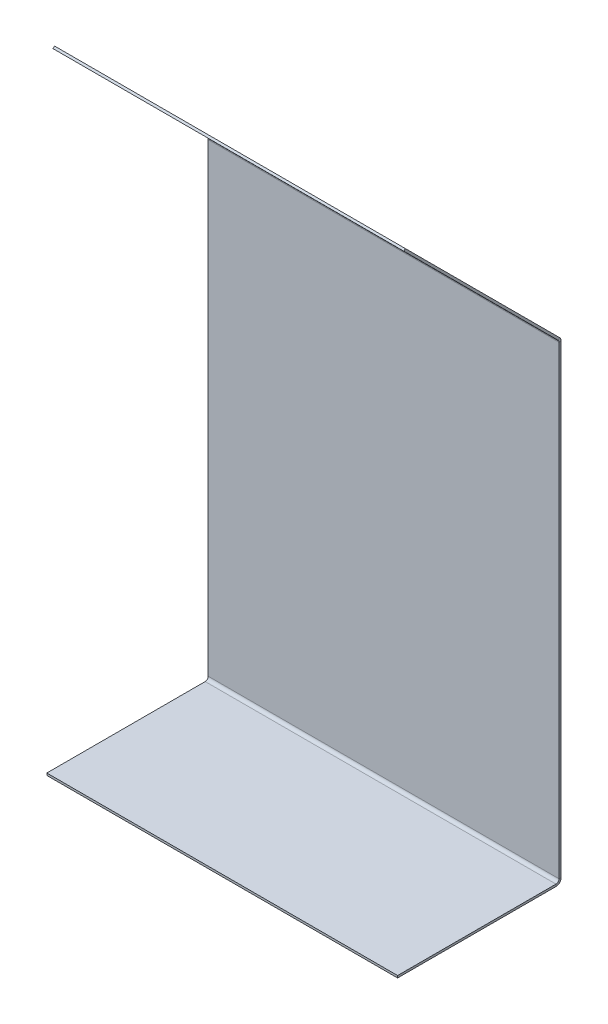
ISO-10303-21;
HEADER;
FILE_DESCRIPTION(('STEP AP214'),'2;1');
FILE_NAME('part.step','',(''),(''),'','','');
FILE_SCHEMA(('AUTOMOTIVE_DESIGN { 1 0 10303 214 1 1 1 1 }'));
ENDSEC;
DATA;
#1=APPLICATION_CONTEXT('core data for automotive mechanical design processes');
#2=APPLICATION_PROTOCOL_DEFINITION('international standard','automotive_design',2000,#1);
#3=PRODUCT_CONTEXT('',#1,'mechanical');
#4=PRODUCT('Part','Part','',(#3));
#5=PRODUCT_RELATED_PRODUCT_CATEGORY('part','',(#4));
#6=PRODUCT_DEFINITION_FORMATION('','',#4);
#7=PRODUCT_DEFINITION_CONTEXT('part definition',#1,'design');
#8=PRODUCT_DEFINITION('design','',#6,#7);
#9=PRODUCT_DEFINITION_SHAPE('','',#8);
#10=(LENGTH_UNIT() NAMED_UNIT(*) SI_UNIT(.MILLI.,.METRE.));
#11=(NAMED_UNIT(*) PLANE_ANGLE_UNIT() SI_UNIT($,.RADIAN.));
#12=(NAMED_UNIT(*) SI_UNIT($,.STERADIAN.) SOLID_ANGLE_UNIT());
#13=UNCERTAINTY_MEASURE_WITH_UNIT(LENGTH_MEASURE(1.E-05),#10,'distance_accuracy_value','');
#14=(GEOMETRIC_REPRESENTATION_CONTEXT(3) GLOBAL_UNCERTAINTY_ASSIGNED_CONTEXT((#13)) GLOBAL_UNIT_ASSIGNED_CONTEXT((#10,
#11,#12)) REPRESENTATION_CONTEXT('',''));
#15=CARTESIAN_POINT('',(0.,0.,0.));
#16=DIRECTION('',(0.,0.,1.));
#17=DIRECTION('',(1.,0.,0.));
#18=AXIS2_PLACEMENT_3D('',#15,#16,#17);
#19=CARTESIAN_POINT('',(57.15,-0.7,25.4));
#20=DIRECTION('',(1.,0.,0.));
#21=DIRECTION('',(0.,0.,-1.));
#22=AXIS2_PLACEMENT_3D('',#19,#20,#21);
#23=PLANE('',#22);
#24=DIRECTION('',(0.,0.,-1.));
#25=VECTOR('',#24,1.);
#26=CARTESIAN_POINT('',(57.15,0.,25.4));
#27=LINE('',#26,#25);
#28=CARTESIAN_POINT('',(57.15,0.,25.4));
#29=VERTEX_POINT('',#28);
#30=CARTESIAN_POINT('',(57.15,0.,-26.2));
#31=VERTEX_POINT('',#30);
#32=EDGE_CURVE('E272',#29,#31,#27,.T.);
#33=ORIENTED_EDGE('',*,*,#32,.F.);
#34=DIRECTION('',(0.,1.,0.));
#35=VECTOR('',#34,1.);
#36=CARTESIAN_POINT('',(57.15,-0.7,25.4));
#37=LINE('',#36,#35);
#38=CARTESIAN_POINT('',(57.15,-0.7,25.4));
#39=VERTEX_POINT('',#38);
#40=EDGE_CURVE('E13',#39,#29,#37,.T.);
#41=ORIENTED_EDGE('',*,*,#40,.F.);
#42=DIRECTION('',(0.,0.,-1.));
#43=VECTOR('',#42,1.);
#44=CARTESIAN_POINT('',(57.15,-0.7,25.4));
#45=LINE('',#44,#43);
#46=CARTESIAN_POINT('',(57.15,-0.700000000000011,-26.2));
#47=VERTEX_POINT('',#46);
#48=EDGE_CURVE('E275',#39,#47,#45,.T.);
#49=ORIENTED_EDGE('',*,*,#48,.T.);
#50=DIRECTION('',(0.,-1.,0.));
#51=VECTOR('',#50,1.);
#52=CARTESIAN_POINT('',(57.15,0.,-26.2));
#53=LINE('',#52,#51);
#54=EDGE_CURVE('E270',#31,#47,#53,.T.);
#55=ORIENTED_EDGE('',*,*,#54,.F.);
#56=EDGE_LOOP('',(#33,#41,#49,#55));
#57=FACE_BOUND('',#56,.T.);
#58=ADVANCED_FACE('F77',(#57),#23,.T.);
#59=CARTESIAN_POINT('',(-57.15,-0.7,25.4));
#60=DIRECTION('',(0.,0.,1.));
#61=DIRECTION('',(1.,0.,0.));
#62=AXIS2_PLACEMENT_3D('',#59,#60,#61);
#63=PLANE('',#62);
#64=DIRECTION('',(1.,0.,0.));
#65=VECTOR('',#64,1.);
#66=CARTESIAN_POINT('',(-57.15,0.,25.4));
#67=LINE('',#66,#65);
#68=CARTESIAN_POINT('',(-57.15,0.,25.4));
#69=VERTEX_POINT('',#68);
#70=EDGE_CURVE('E278',#69,#29,#67,.T.);
#71=ORIENTED_EDGE('',*,*,#70,.F.);
#72=DIRECTION('',(0.,1.,0.));
#73=VECTOR('',#72,1.);
#74=CARTESIAN_POINT('',(-57.15,-0.7,25.4));
#75=LINE('',#74,#73);
#76=CARTESIAN_POINT('',(-57.15,-0.7,25.4));
#77=VERTEX_POINT('',#76);
#78=EDGE_CURVE('E80',#77,#69,#75,.T.);
#79=ORIENTED_EDGE('',*,*,#78,.F.);
#80=DIRECTION('',(1.,0.,0.));
#81=VECTOR('',#80,1.);
#82=CARTESIAN_POINT('',(-57.15,-0.7,25.4));
#83=LINE('',#82,#81);
#84=EDGE_CURVE('E280',#77,#39,#83,.T.);
#85=ORIENTED_EDGE('',*,*,#84,.T.);
#86=ORIENTED_EDGE('',*,*,#40,.T.);
#87=EDGE_LOOP('',(#71,#79,#85,#86));
#88=FACE_BOUND('',#87,.T.);
#89=ADVANCED_FACE('F294',(#88),#63,.T.);
#90=CARTESIAN_POINT('',(-57.15,-0.7,25.4));
#91=DIRECTION('',(-1.,0.,0.));
#92=DIRECTION('',(0.,0.,1.));
#93=AXIS2_PLACEMENT_3D('',#90,#91,#92);
#94=PLANE('',#93);
#95=DIRECTION('',(0.,0.,1.));
#96=VECTOR('',#95,1.);
#97=CARTESIAN_POINT('',(-57.15,0.,25.4));
#98=LINE('',#97,#96);
#99=CARTESIAN_POINT('',(-57.15,0.,-26.2));
#100=VERTEX_POINT('',#99);
#101=EDGE_CURVE('E285',#100,#69,#98,.T.);
#102=ORIENTED_EDGE('',*,*,#101,.F.);
#103=DIRECTION('',(0.,-1.,0.));
#104=VECTOR('',#103,1.);
#105=CARTESIAN_POINT('',(-57.15,0.,-26.2));
#106=LINE('',#105,#104);
#107=CARTESIAN_POINT('',(-57.15,-0.700000000000011,-26.2));
#108=VERTEX_POINT('',#107);
#109=EDGE_CURVE('E260',#100,#108,#106,.T.);
#110=ORIENTED_EDGE('',*,*,#109,.T.);
#111=DIRECTION('',(0.,0.,1.));
#112=VECTOR('',#111,1.);
#113=CARTESIAN_POINT('',(-57.15,-0.7,25.4));
#114=LINE('',#113,#112);
#115=EDGE_CURVE('E277',#108,#77,#114,.T.);
#116=ORIENTED_EDGE('',*,*,#115,.T.);
#117=ORIENTED_EDGE('',*,*,#78,.T.);
#118=EDGE_LOOP('',(#102,#110,#116,#117));
#119=FACE_BOUND('',#118,.T.);
#120=ADVANCED_FACE('F343',(#119),#94,.T.);
#121=CARTESIAN_POINT('',(0.,-0.7,0.));
#122=DIRECTION('',(0.,-1.,0.));
#123=DIRECTION('',(0.,0.,-1.));
#124=AXIS2_PLACEMENT_3D('',#121,#122,#123);
#125=PLANE('',#124);
#126=ORIENTED_EDGE('',*,*,#48,.F.);
#127=ORIENTED_EDGE('',*,*,#84,.F.);
#128=ORIENTED_EDGE('',*,*,#115,.F.);
#129=DIRECTION('',(-1.,0.,0.));
#130=VECTOR('',#129,1.);
#131=CARTESIAN_POINT('',(-57.15,-0.700000000000011,-26.2));
#132=LINE('',#131,#130);
#133=EDGE_CURVE('E255',#108,#47,#132,.F.);
#134=ORIENTED_EDGE('',*,*,#133,.T.);
#135=EDGE_LOOP('',(#126,#127,#128,#134));
#136=FACE_BOUND('',#135,.T.);
#137=ADVANCED_FACE('F342',(#136),#125,.T.);
#138=CARTESIAN_POINT('',(0.,0.,0.));
#139=DIRECTION('',(0.,-1.,0.));
#140=DIRECTION('',(0.,0.,-1.));
#141=AXIS2_PLACEMENT_3D('',#138,#139,#140);
#142=PLANE('',#141);
#143=ORIENTED_EDGE('',*,*,#32,.T.);
#144=DIRECTION('',(-1.,0.,0.));
#145=VECTOR('',#144,1.);
#146=CARTESIAN_POINT('',(-57.15,0.,-26.2));
#147=LINE('',#146,#145);
#148=EDGE_CURVE('E266',#100,#31,#147,.F.);
#149=ORIENTED_EDGE('',*,*,#148,.F.);
#150=ORIENTED_EDGE('',*,*,#101,.T.);
#151=ORIENTED_EDGE('',*,*,#70,.T.);
#152=EDGE_LOOP('',(#143,#149,#150,#151));
#153=FACE_BOUND('',#152,.T.);
#154=ADVANCED_FACE('F290',(#153),#142,.F.);
#155=CARTESIAN_POINT('',(57.15,0.99999999999999,-26.2));
#156=DIRECTION('',(1.,0.,0.));
#157=DIRECTION('',(0.,0.,-1.));
#158=AXIS2_PLACEMENT_3D('',#155,#156,#157);
#159=PLANE('',#158);
#160=DIRECTION('',(0.,0.,1.));
#161=VECTOR('',#160,1.);
#162=CARTESIAN_POINT('',(57.15,1.,-27.9));
#163=LINE('',#162,#161);
#164=CARTESIAN_POINT('',(57.15,0.999999999999987,-27.2));
#165=VERTEX_POINT('',#164);
#166=CARTESIAN_POINT('',(57.15,0.999999999999985,-27.9));
#167=VERTEX_POINT('',#166);
#168=EDGE_CURVE('E213',#165,#167,#163,.F.);
#169=ORIENTED_EDGE('',*,*,#168,.F.);
#170=CARTESIAN_POINT('',(57.15,0.99999999999999,-26.2));
#171=DIRECTION('',(-1.,0.,0.));
#172=DIRECTION('',(0.,0.,1.));
#173=AXIS2_PLACEMENT_3D('',#170,#171,#172);
#174=CIRCLE('',#173,1.);
#175=EDGE_CURVE('E263',#31,#165,#174,.F.);
#176=ORIENTED_EDGE('',*,*,#175,.F.);
#177=ORIENTED_EDGE('',*,*,#54,.T.);
#178=CARTESIAN_POINT('',(57.15,0.99999999999999,-26.2));
#179=DIRECTION('',(-1.,0.,0.));
#180=DIRECTION('',(0.,0.,1.));
#181=AXIS2_PLACEMENT_3D('',#178,#179,#180);
#182=CIRCLE('',#181,1.7);
#183=EDGE_CURVE('E109',#47,#167,#182,.F.);
#184=ORIENTED_EDGE('',*,*,#183,.T.);
#185=EDGE_LOOP('',(#169,#176,#177,#184));
#186=FACE_BOUND('',#185,.T.);
#187=ADVANCED_FACE('F298',(#186),#159,.T.);
#188=CARTESIAN_POINT('',(-57.15,0.99999999999999,-26.2));
#189=DIRECTION('',(1.,0.,0.));
#190=DIRECTION('',(0.,0.,-1.));
#191=AXIS2_PLACEMENT_3D('',#188,#189,#190);
#192=PLANE('',#191);
#193=CARTESIAN_POINT('',(-57.15,0.99999999999999,-26.2));
#194=DIRECTION('',(-1.,0.,0.));
#195=DIRECTION('',(0.,0.,1.));
#196=AXIS2_PLACEMENT_3D('',#193,#194,#195);
#197=CIRCLE('',#196,1.);
#198=CARTESIAN_POINT('',(-57.15,0.999999999999987,-27.2));
#199=VERTEX_POINT('',#198);
#200=EDGE_CURVE('E225',#199,#100,#197,.T.);
#201=ORIENTED_EDGE('',*,*,#200,.F.);
#202=DIRECTION('',(0.,0.,1.));
#203=VECTOR('',#202,1.);
#204=CARTESIAN_POINT('',(-57.15,0.999999999999997,-27.2));
#205=LINE('',#204,#203);
#206=CARTESIAN_POINT('',(-57.15,1.,-27.9));
#207=VERTEX_POINT('',#206);
#208=EDGE_CURVE('E248',#199,#207,#205,.F.);
#209=ORIENTED_EDGE('',*,*,#208,.T.);
#210=CARTESIAN_POINT('',(-57.15,0.99999999999999,-26.2));
#211=DIRECTION('',(-1.,0.,0.));
#212=DIRECTION('',(0.,0.,1.));
#213=AXIS2_PLACEMENT_3D('',#210,#211,#212);
#214=CIRCLE('',#213,1.7);
#215=EDGE_CURVE('E258',#207,#108,#214,.T.);
#216=ORIENTED_EDGE('',*,*,#215,.T.);
#217=ORIENTED_EDGE('',*,*,#109,.F.);
#218=EDGE_LOOP('',(#201,#209,#216,#217));
#219=FACE_BOUND('',#218,.T.);
#220=ADVANCED_FACE('F338',(#219),#192,.F.);
#221=CARTESIAN_POINT('',(-57.15,0.99999999999999,-26.2));
#222=DIRECTION('',(-1.,0.,0.));
#223=DIRECTION('',(0.,0.,-1.));
#224=AXIS2_PLACEMENT_3D('',#221,#222,#223);
#225=CYLINDRICAL_SURFACE('',#224,1.7);
#226=ORIENTED_EDGE('',*,*,#133,.F.);
#227=ORIENTED_EDGE('',*,*,#215,.F.);
#228=DIRECTION('',(-1.,0.,0.));
#229=VECTOR('',#228,1.);
#230=CARTESIAN_POINT('',(57.15,1.,-27.9));
#231=LINE('',#230,#229);
#232=EDGE_CURVE('E246',#207,#167,#231,.F.);
#233=ORIENTED_EDGE('',*,*,#232,.T.);
#234=ORIENTED_EDGE('',*,*,#183,.F.);
#235=EDGE_LOOP('',(#226,#227,#233,#234));
#236=FACE_BOUND('',#235,.T.);
#237=ADVANCED_FACE('F340',(#236),#225,.T.);
#238=CARTESIAN_POINT('',(-57.15,0.99999999999999,-26.2));
#239=DIRECTION('',(-1.,0.,0.));
#240=DIRECTION('',(0.,0.,-1.));
#241=AXIS2_PLACEMENT_3D('',#238,#239,#240);
#242=CYLINDRICAL_SURFACE('',#241,1.);
#243=ORIENTED_EDGE('',*,*,#148,.T.);
#244=ORIENTED_EDGE('',*,*,#175,.T.);
#245=DIRECTION('',(-1.,0.,0.));
#246=VECTOR('',#245,1.);
#247=CARTESIAN_POINT('',(57.15,0.999999999999997,-27.2));
#248=LINE('',#247,#246);
#249=EDGE_CURVE('E251',#165,#199,#248,.T.);
#250=ORIENTED_EDGE('',*,*,#249,.T.);
#251=ORIENTED_EDGE('',*,*,#200,.T.);
#252=EDGE_LOOP('',(#243,#244,#250,#251));
#253=FACE_BOUND('',#252,.T.);
#254=ADVANCED_FACE('F301',(#253),#242,.F.);
#255=CARTESIAN_POINT('',(57.15,0.,-27.9));
#256=DIRECTION('',(-1.,0.,0.));
#257=DIRECTION('',(0.,0.,1.));
#258=AXIS2_PLACEMENT_3D('',#255,#256,#257);
#259=PLANE('',#258);
#260=ORIENTED_EDGE('',*,*,#168,.T.);
#261=DIRECTION('',(0.,-1.,0.));
#262=VECTOR('',#261,1.);
#263=CARTESIAN_POINT('',(57.15,0.,-27.9));
#264=LINE('',#263,#262);
#265=CARTESIAN_POINT('',(57.15,152.4,-27.9000000000005));
#266=VERTEX_POINT('',#265);
#267=EDGE_CURVE('E235',#266,#167,#264,.T.);
#268=ORIENTED_EDGE('',*,*,#267,.F.);
#269=DIRECTION('',(0.,0.,1.));
#270=VECTOR('',#269,1.);
#271=CARTESIAN_POINT('',(57.15,152.4,-27.9000000000005));
#272=LINE('',#271,#270);
#273=CARTESIAN_POINT('',(57.15,152.4,-27.2000000000006));
#274=VERTEX_POINT('',#273);
#275=EDGE_CURVE('E226',#266,#274,#272,.T.);
#276=ORIENTED_EDGE('',*,*,#275,.T.);
#277=DIRECTION('',(0.,1.,0.));
#278=VECTOR('',#277,1.);
#279=CARTESIAN_POINT('',(57.15,0.,-27.2));
#280=LINE('',#279,#278);
#281=EDGE_CURVE('E243',#274,#165,#280,.F.);
#282=ORIENTED_EDGE('',*,*,#281,.T.);
#283=EDGE_LOOP('',(#260,#268,#276,#282));
#284=FACE_BOUND('',#283,.T.);
#285=ADVANCED_FACE('F309',(#284),#259,.F.);
#286=CARTESIAN_POINT('',(-57.15,152.4,-27.9000000000005));
#287=DIRECTION('',(1.,0.,0.));
#288=DIRECTION('',(0.,1.,0.));
#289=AXIS2_PLACEMENT_3D('',#286,#287,#288);
#290=PLANE('',#289);
#291=ORIENTED_EDGE('',*,*,#208,.F.);
#292=DIRECTION('',(0.,-1.,0.));
#293=VECTOR('',#292,1.);
#294=CARTESIAN_POINT('',(-57.15,152.4,-27.2000000000005));
#295=LINE('',#294,#293);
#296=CARTESIAN_POINT('',(-57.15,152.4,-27.2000000000006));
#297=VERTEX_POINT('',#296);
#298=EDGE_CURVE('E240',#199,#297,#295,.F.);
#299=ORIENTED_EDGE('',*,*,#298,.T.);
#300=DIRECTION('',(0.,0.,1.));
#301=VECTOR('',#300,1.);
#302=CARTESIAN_POINT('',(-57.15,152.4,-27.9000000000005));
#303=LINE('',#302,#301);
#304=CARTESIAN_POINT('',(-57.15,152.4,-27.9000000000006));
#305=VERTEX_POINT('',#304);
#306=EDGE_CURVE('E223',#305,#297,#303,.T.);
#307=ORIENTED_EDGE('',*,*,#306,.F.);
#308=DIRECTION('',(0.,1.,0.));
#309=VECTOR('',#308,1.);
#310=CARTESIAN_POINT('',(-57.15,0.,-27.9));
#311=LINE('',#310,#309);
#312=EDGE_CURVE('E232',#207,#305,#311,.T.);
#313=ORIENTED_EDGE('',*,*,#312,.F.);
#314=EDGE_LOOP('',(#291,#299,#307,#313));
#315=FACE_BOUND('',#314,.T.);
#316=ADVANCED_FACE('F336',(#315),#290,.F.);
#317=CARTESIAN_POINT('',(0.,0.,-27.9));
#318=DIRECTION('',(0.,0.,1.));
#319=DIRECTION('',(0.,-1.,0.));
#320=AXIS2_PLACEMENT_3D('',#317,#318,#319);
#321=PLANE('',#320);
#322=ORIENTED_EDGE('',*,*,#232,.F.);
#323=ORIENTED_EDGE('',*,*,#312,.T.);
#324=DIRECTION('',(1.,0.,0.));
#325=VECTOR('',#324,1.);
#326=CARTESIAN_POINT('',(0.,152.4,-27.9000000000005));
#327=LINE('',#326,#325);
#328=EDGE_CURVE('E229',#305,#266,#327,.T.);
#329=ORIENTED_EDGE('',*,*,#328,.T.);
#330=ORIENTED_EDGE('',*,*,#267,.T.);
#331=EDGE_LOOP('',(#322,#323,#329,#330));
#332=FACE_BOUND('',#331,.T.);
#333=ADVANCED_FACE('F317',(#332),#321,.F.);
#334=CARTESIAN_POINT('',(0.,0.,-27.2));
#335=DIRECTION('',(0.,0.,1.));
#336=DIRECTION('',(0.,-1.,0.));
#337=AXIS2_PLACEMENT_3D('',#334,#335,#336);
#338=PLANE('',#337);
#339=ORIENTED_EDGE('',*,*,#298,.F.);
#340=ORIENTED_EDGE('',*,*,#249,.F.);
#341=ORIENTED_EDGE('',*,*,#281,.F.);
#342=DIRECTION('',(-1.,0.,0.));
#343=VECTOR('',#342,1.);
#344=CARTESIAN_POINT('',(57.15,152.4,-27.2000000000005));
#345=LINE('',#344,#343);
#346=EDGE_CURVE('E238',#297,#274,#345,.F.);
#347=ORIENTED_EDGE('',*,*,#346,.F.);
#348=EDGE_LOOP('',(#339,#340,#341,#347));
#349=FACE_BOUND('',#348,.T.);
#350=ADVANCED_FACE('F306',(#349),#338,.T.);
#351=CARTESIAN_POINT('',(57.15,152.4,-26.2000000000006));
#352=DIRECTION('',(1.,0.,0.));
#353=DIRECTION('',(0.,0.,-1.));
#354=AXIS2_PLACEMENT_3D('',#351,#352,#353);
#355=PLANE('',#354);
#356=DIRECTION('',(0.,-0.707106781186541,0.707106781186554));
#357=VECTOR('',#356,1.);
#358=CARTESIAN_POINT('',(57.15,153.602081528017,-27.4020815280177));
#359=LINE('',#358,#357);
#360=CARTESIAN_POINT('',(57.15,153.107106781187,-26.9071067811871));
#361=VERTEX_POINT('',#360);
#362=CARTESIAN_POINT('',(57.15,153.602081528017,-27.4020815280177));
#363=VERTEX_POINT('',#362);
#364=EDGE_CURVE('E192',#361,#363,#359,.F.);
#365=ORIENTED_EDGE('',*,*,#364,.F.);
#366=CARTESIAN_POINT('',(57.15,152.4,-26.2000000000006));
#367=DIRECTION('',(-1.,0.,0.));
#368=DIRECTION('',(0.,0.,1.));
#369=AXIS2_PLACEMENT_3D('',#366,#367,#368);
#370=CIRCLE('',#369,1.00000000000001);
#371=EDGE_CURVE('E217',#274,#361,#370,.F.);
#372=ORIENTED_EDGE('',*,*,#371,.F.);
#373=ORIENTED_EDGE('',*,*,#275,.F.);
#374=CARTESIAN_POINT('',(57.15,152.4,-26.2000000000006));
#375=DIRECTION('',(-1.,0.,0.));
#376=DIRECTION('',(0.,0.,1.));
#377=AXIS2_PLACEMENT_3D('',#374,#375,#376);
#378=CIRCLE('',#377,1.70000000000001);
#379=EDGE_CURVE('E210',#266,#363,#378,.F.);
#380=ORIENTED_EDGE('',*,*,#379,.T.);
#381=EDGE_LOOP('',(#365,#372,#373,#380));
#382=FACE_BOUND('',#381,.T.);
#383=ADVANCED_FACE('F314',(#382),#355,.T.);
#384=CARTESIAN_POINT('',(-57.15,152.4,-26.2000000000006));
#385=DIRECTION('',(1.,0.,0.));
#386=DIRECTION('',(0.,0.,-1.));
#387=AXIS2_PLACEMENT_3D('',#384,#385,#386);
#388=PLANE('',#387);
#389=CARTESIAN_POINT('',(-57.15,152.4,-26.2000000000006));
#390=DIRECTION('',(-1.,0.,0.));
#391=DIRECTION('',(0.,0.,1.));
#392=AXIS2_PLACEMENT_3D('',#389,#390,#391);
#393=CIRCLE('',#392,1.00000000000001);
#394=CARTESIAN_POINT('',(-57.15,153.107106781187,-26.9071067811871));
#395=VERTEX_POINT('',#394);
#396=EDGE_CURVE('E220',#395,#297,#393,.T.);
#397=ORIENTED_EDGE('',*,*,#396,.F.);
#398=DIRECTION('',(0.,-0.707106781186541,0.707106781186554));
#399=VECTOR('',#398,1.);
#400=CARTESIAN_POINT('',(-57.15,153.107106781187,-26.9071067811871));
#401=LINE('',#400,#399);
#402=CARTESIAN_POINT('',(-57.15,153.602081528017,-27.4020815280177));
#403=VERTEX_POINT('',#402);
#404=EDGE_CURVE('E204',#395,#403,#401,.F.);
#405=ORIENTED_EDGE('',*,*,#404,.T.);
#406=CARTESIAN_POINT('',(-57.15,152.4,-26.2000000000006));
#407=DIRECTION('',(-1.,0.,0.));
#408=DIRECTION('',(0.,0.,1.));
#409=AXIS2_PLACEMENT_3D('',#406,#407,#408);
#410=CIRCLE('',#409,1.70000000000001);
#411=EDGE_CURVE('E214',#403,#305,#410,.T.);
#412=ORIENTED_EDGE('',*,*,#411,.T.);
#413=ORIENTED_EDGE('',*,*,#306,.T.);
#414=EDGE_LOOP('',(#397,#405,#412,#413));
#415=FACE_BOUND('',#414,.T.);
#416=ADVANCED_FACE('F324',(#415),#388,.F.);
#417=CARTESIAN_POINT('',(-57.15,152.4,-26.2000000000006));
#418=DIRECTION('',(-1.,0.,0.));
#419=DIRECTION('',(0.,0.707106781186541,-0.707106781186554));
#420=AXIS2_PLACEMENT_3D('',#417,#418,#419);
#421=CYLINDRICAL_SURFACE('',#420,1.70000000000001);
#422=ORIENTED_EDGE('',*,*,#328,.F.);
#423=ORIENTED_EDGE('',*,*,#411,.F.);
#424=DIRECTION('',(-1.,0.,0.));
#425=VECTOR('',#424,1.);
#426=CARTESIAN_POINT('',(57.15,153.602081528017,-27.4020815280177));
#427=LINE('',#426,#425);
#428=EDGE_CURVE('E202',#403,#363,#427,.F.);
#429=ORIENTED_EDGE('',*,*,#428,.T.);
#430=ORIENTED_EDGE('',*,*,#379,.F.);
#431=EDGE_LOOP('',(#422,#423,#429,#430));
#432=FACE_BOUND('',#431,.T.);
#433=ADVANCED_FACE('F321',(#432),#421,.T.);
#434=CARTESIAN_POINT('',(-57.15,152.4,-26.2000000000006));
#435=DIRECTION('',(-1.,0.,0.));
#436=DIRECTION('',(0.,0.707106781186541,-0.707106781186554));
#437=AXIS2_PLACEMENT_3D('',#434,#435,#436);
#438=CYLINDRICAL_SURFACE('',#437,1.00000000000001);
#439=ORIENTED_EDGE('',*,*,#346,.T.);
#440=ORIENTED_EDGE('',*,*,#371,.T.);
#441=DIRECTION('',(-1.,0.,0.));
#442=VECTOR('',#441,1.);
#443=CARTESIAN_POINT('',(57.15,153.107106781187,-26.9071067811871));
#444=LINE('',#443,#442);
#445=EDGE_CURVE('E207',#361,#395,#444,.T.);
#446=ORIENTED_EDGE('',*,*,#445,.T.);
#447=ORIENTED_EDGE('',*,*,#396,.T.);
#448=EDGE_LOOP('',(#439,#440,#446,#447));
#449=FACE_BOUND('',#448,.T.);
#450=ADVANCED_FACE('F333',(#449),#438,.F.);
#451=CARTESIAN_POINT('',(-57.15,203.896491676802,22.8923286207662));
#452=DIRECTION('',(1.,0.,0.));
#453=DIRECTION('',(0.,1.,0.));
#454=AXIS2_PLACEMENT_3D('',#451,#452,#453);
#455=PLANE('',#454);
#456=ORIENTED_EDGE('',*,*,#404,.F.);
#457=DIRECTION('',(0.,-0.707106781186554,-0.707106781186541));
#458=VECTOR('',#457,1.);
#459=CARTESIAN_POINT('',(-57.15,203.401516929971,23.3873033675967));
#460=LINE('',#459,#458);
#461=CARTESIAN_POINT('',(-57.15,203.401516929971,23.3873033675967));
#462=VERTEX_POINT('',#461);
#463=EDGE_CURVE('E200',#395,#462,#460,.F.);
#464=ORIENTED_EDGE('',*,*,#463,.T.);
#465=DIRECTION('',(0.,-0.707106781186541,0.707106781186554));
#466=VECTOR('',#465,1.);
#467=CARTESIAN_POINT('',(-57.15,203.896491676802,22.8923286207662));
#468=LINE('',#467,#466);
#469=CARTESIAN_POINT('',(-57.15,203.896491676802,22.8923286207661));
#470=VERTEX_POINT('',#469);
#471=EDGE_CURVE('E188',#470,#462,#468,.T.);
#472=ORIENTED_EDGE('',*,*,#471,.F.);
#473=DIRECTION('',(0.,0.707106781186554,0.707106781186541));
#474=VECTOR('',#473,1.);
#475=CARTESIAN_POINT('',(-57.15,90.7091883092026,-90.2949747468311));
#476=LINE('',#475,#474);
#477=EDGE_CURVE('E175',#403,#470,#476,.T.);
#478=ORIENTED_EDGE('',*,*,#477,.F.);
#479=EDGE_LOOP('',(#456,#464,#472,#478));
#480=FACE_BOUND('',#479,.T.);
#481=ADVANCED_FACE('F328',(#480),#455,.F.);
#482=CARTESIAN_POINT('',(57.15,153.309188309204,-27.6949747468311));
#483=DIRECTION('',(-1.,0.,0.));
#484=DIRECTION('',(0.,0.,1.));
#485=AXIS2_PLACEMENT_3D('',#482,#483,#484);
#486=PLANE('',#485);
#487=ORIENTED_EDGE('',*,*,#364,.T.);
#488=DIRECTION('',(0.,-0.707106781186554,-0.707106781186541));
#489=VECTOR('',#488,1.);
#490=CARTESIAN_POINT('',(57.15,90.7091883092026,-90.2949747468311));
#491=LINE('',#490,#489);
#492=CARTESIAN_POINT('',(57.15,203.896491676802,22.8923286207661));
#493=VERTEX_POINT('',#492);
#494=EDGE_CURVE('E173',#493,#363,#491,.T.);
#495=ORIENTED_EDGE('',*,*,#494,.F.);
#496=DIRECTION('',(0.,-0.707106781186541,0.707106781186554));
#497=VECTOR('',#496,1.);
#498=CARTESIAN_POINT('',(57.15,203.896491676802,22.8923286207662));
#499=LINE('',#498,#497);
#500=CARTESIAN_POINT('',(57.15,203.401516929971,23.3873033675967));
#501=VERTEX_POINT('',#500);
#502=EDGE_CURVE('E181',#493,#501,#499,.T.);
#503=ORIENTED_EDGE('',*,*,#502,.T.);
#504=DIRECTION('',(0.,0.707106781186554,0.707106781186541));
#505=VECTOR('',#504,1.);
#506=CARTESIAN_POINT('',(57.15,152.814213562373,-27.2000000000006));
#507=LINE('',#506,#505);
#508=EDGE_CURVE('E197',#501,#361,#507,.F.);
#509=ORIENTED_EDGE('',*,*,#508,.T.);
#510=EDGE_LOOP('',(#487,#495,#503,#509));
#511=FACE_BOUND('',#510,.T.);
#512=ADVANCED_FACE('F191',(#511),#486,.F.);
#513=CARTESIAN_POINT('',(0.,90.7091883092026,-90.2949747468311));
#514=DIRECTION('',(0.,-0.707106781186541,0.707106781186554));
#515=DIRECTION('',(0.,-0.707106781186554,-0.707106781186541));
#516=AXIS2_PLACEMENT_3D('',#513,#514,#515);
#517=PLANE('',#516);
#518=ORIENTED_EDGE('',*,*,#428,.F.);
#519=ORIENTED_EDGE('',*,*,#477,.T.);
#520=DIRECTION('',(1.,0.,0.));
#521=VECTOR('',#520,1.);
#522=CARTESIAN_POINT('',(0.,203.896491676802,22.8923286207661));
#523=LINE('',#522,#521);
#524=EDGE_CURVE('E168',#470,#493,#523,.T.);
#525=ORIENTED_EDGE('',*,*,#524,.T.);
#526=ORIENTED_EDGE('',*,*,#494,.T.);
#527=EDGE_LOOP('',(#518,#519,#525,#526));
#528=FACE_BOUND('',#527,.T.);
#529=ADVANCED_FACE('F171',(#528),#517,.F.);
#530=CARTESIAN_POINT('',(0.,90.2142135623721,-89.8000000000005));
#531=DIRECTION('',(0.,-0.707106781186541,0.707106781186554));
#532=DIRECTION('',(0.,-0.707106781186554,-0.707106781186541));
#533=AXIS2_PLACEMENT_3D('',#530,#531,#532);
#534=PLANE('',#533);
#535=ORIENTED_EDGE('',*,*,#463,.F.);
#536=ORIENTED_EDGE('',*,*,#445,.F.);
#537=ORIENTED_EDGE('',*,*,#508,.F.);
#538=DIRECTION('',(-1.,0.,0.));
#539=VECTOR('',#538,1.);
#540=CARTESIAN_POINT('',(57.15,203.401516929971,23.3873033675967));
#541=LINE('',#540,#539);
#542=EDGE_CURVE('E184',#462,#501,#541,.F.);
#543=ORIENTED_EDGE('',*,*,#542,.F.);
#544=EDGE_LOOP('',(#535,#536,#537,#543));
#545=FACE_BOUND('',#544,.T.);
#546=ADVANCED_FACE('F330',(#545),#534,.T.);
#547=CARTESIAN_POINT('',(57.15,203.896491676802,22.8923286207662));
#548=DIRECTION('',(0.,-0.707106781186554,-0.707106781186541));
#549=DIRECTION('',(0.,0.707106781186541,-0.707106781186554));
#550=AXIS2_PLACEMENT_3D('',#547,#548,#549);
#551=PLANE('',#550);
#552=ORIENTED_EDGE('',*,*,#542,.T.);
#553=ORIENTED_EDGE('',*,*,#502,.F.);
#554=ORIENTED_EDGE('',*,*,#524,.F.);
#555=ORIENTED_EDGE('',*,*,#471,.T.);
#556=EDGE_LOOP('',(#552,#553,#554,#555));
#557=FACE_BOUND('',#556,.T.);
#558=ADVANCED_FACE('F182',(#557),#551,.F.);
#559=CLOSED_SHELL('',(#58,#89,#120,#137,#154,#187,#220,#237,#254,#285,#316,#333,#350,#383,#416,
#433,#450,#481,#512,#529,#546,#558));
#560=MANIFOLD_SOLID_BREP('B2',#559);
#561=ADVANCED_BREP_SHAPE_REPRESENTATION('',(#18,#560),#14);
#562=SHAPE_DEFINITION_REPRESENTATION(#9,#561);
ENDSEC;
END-ISO-10303-21;
